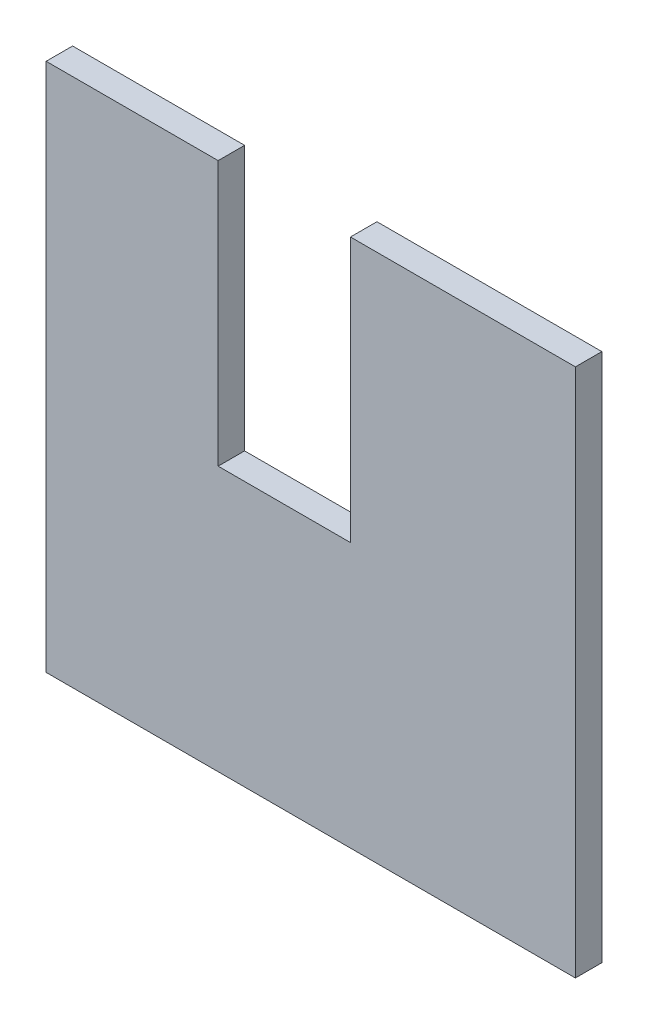
ISO-10303-21;
HEADER;
FILE_DESCRIPTION(('STEP AP214'),'2;1');
FILE_NAME('part.step','',(''),(''),'','','');
FILE_SCHEMA(('AUTOMOTIVE_DESIGN { 1 0 10303 214 1 1 1 1 }'));
ENDSEC;
DATA;
#1=APPLICATION_CONTEXT('core data for automotive mechanical design processes');
#2=APPLICATION_PROTOCOL_DEFINITION('international standard','automotive_design',2000,#1);
#3=PRODUCT_CONTEXT('',#1,'mechanical');
#4=PRODUCT('Part','Part','',(#3));
#5=PRODUCT_RELATED_PRODUCT_CATEGORY('part','',(#4));
#6=PRODUCT_DEFINITION_FORMATION('','',#4);
#7=PRODUCT_DEFINITION_CONTEXT('part definition',#1,'design');
#8=PRODUCT_DEFINITION('design','',#6,#7);
#9=PRODUCT_DEFINITION_SHAPE('','',#8);
#10=(LENGTH_UNIT() NAMED_UNIT(*) SI_UNIT(.MILLI.,.METRE.));
#11=(NAMED_UNIT(*) PLANE_ANGLE_UNIT() SI_UNIT($,.RADIAN.));
#12=(NAMED_UNIT(*) SI_UNIT($,.STERADIAN.) SOLID_ANGLE_UNIT());
#13=UNCERTAINTY_MEASURE_WITH_UNIT(LENGTH_MEASURE(1.E-05),#10,'distance_accuracy_value','');
#14=(GEOMETRIC_REPRESENTATION_CONTEXT(3) GLOBAL_UNCERTAINTY_ASSIGNED_CONTEXT((#13)) GLOBAL_UNIT_ASSIGNED_CONTEXT((#10,
#11,#12)) REPRESENTATION_CONTEXT('',''));
#15=CARTESIAN_POINT('',(0.,0.,0.));
#16=DIRECTION('',(0.,0.,1.));
#17=DIRECTION('',(1.,0.,0.));
#18=AXIS2_PLACEMENT_3D('',#15,#16,#17);
#19=CARTESIAN_POINT('',(25.,0.,10.));
#20=DIRECTION('',(-1.,0.,0.));
#21=DIRECTION('',(0.,-1.,0.));
#22=AXIS2_PLACEMENT_3D('',#19,#20,#21);
#23=PLANE('',#22);
#24=DIRECTION('',(0.,1.,0.));
#25=VECTOR('',#24,1.);
#26=CARTESIAN_POINT('',(25.,0.,0.));
#27=LINE('',#26,#25);
#28=CARTESIAN_POINT('',(25.,0.,0.));
#29=VERTEX_POINT('',#28);
#30=CARTESIAN_POINT('',(25.,100.,0.));
#31=VERTEX_POINT('',#30);
#32=EDGE_CURVE('E140',#29,#31,#27,.T.);
#33=ORIENTED_EDGE('',*,*,#32,.F.);
#34=DIRECTION('',(0.,0.,-1.));
#35=VECTOR('',#34,1.);
#36=CARTESIAN_POINT('',(25.,0.,10.));
#37=LINE('',#36,#35);
#38=CARTESIAN_POINT('',(25.,0.,10.));
#39=VERTEX_POINT('',#38);
#40=EDGE_CURVE('E11',#39,#29,#37,.T.);
#41=ORIENTED_EDGE('',*,*,#40,.F.);
#42=DIRECTION('',(0.,1.,0.));
#43=VECTOR('',#42,1.);
#44=CARTESIAN_POINT('',(25.,0.,10.));
#45=LINE('',#44,#43);
#46=CARTESIAN_POINT('',(25.,100.,10.));
#47=VERTEX_POINT('',#46);
#48=EDGE_CURVE('E195',#39,#47,#45,.T.);
#49=ORIENTED_EDGE('',*,*,#48,.T.);
#50=DIRECTION('',(0.,0.,-1.));
#51=VECTOR('',#50,1.);
#52=CARTESIAN_POINT('',(25.,100.,10.));
#53=LINE('',#52,#51);
#54=EDGE_CURVE('E58',#47,#31,#53,.T.);
#55=ORIENTED_EDGE('',*,*,#54,.T.);
#56=EDGE_LOOP('',(#33,#41,#49,#55));
#57=FACE_BOUND('',#56,.T.);
#58=ADVANCED_FACE('F41',(#57),#23,.T.);
#59=CARTESIAN_POINT('',(0.,0.,10.));
#60=DIRECTION('',(0.,1.,0.));
#61=DIRECTION('',(0.,0.,1.));
#62=AXIS2_PLACEMENT_3D('',#59,#60,#61);
#63=PLANE('',#62);
#64=DIRECTION('',(1.,0.,0.));
#65=VECTOR('',#64,1.);
#66=CARTESIAN_POINT('',(0.,0.,0.));
#67=LINE('',#66,#65);
#68=CARTESIAN_POINT('',(-25.,0.,0.));
#69=VERTEX_POINT('',#68);
#70=EDGE_CURVE('E143',#69,#29,#67,.T.);
#71=ORIENTED_EDGE('',*,*,#70,.F.);
#72=DIRECTION('',(0.,0.,-1.));
#73=VECTOR('',#72,1.);
#74=CARTESIAN_POINT('',(-25.,0.,10.));
#75=LINE('',#74,#73);
#76=CARTESIAN_POINT('',(-25.,0.,10.));
#77=VERTEX_POINT('',#76);
#78=EDGE_CURVE('E50',#77,#69,#75,.T.);
#79=ORIENTED_EDGE('',*,*,#78,.F.);
#80=DIRECTION('',(1.,0.,0.));
#81=VECTOR('',#80,1.);
#82=CARTESIAN_POINT('',(0.,0.,10.));
#83=LINE('',#82,#81);
#84=EDGE_CURVE('E191',#77,#39,#83,.T.);
#85=ORIENTED_EDGE('',*,*,#84,.T.);
#86=ORIENTED_EDGE('',*,*,#40,.T.);
#87=EDGE_LOOP('',(#71,#79,#85,#86));
#88=FACE_BOUND('',#87,.T.);
#89=ADVANCED_FACE('F190',(#88),#63,.T.);
#90=CARTESIAN_POINT('',(-25.,0.,10.));
#91=DIRECTION('',(-1.,0.,0.));
#92=DIRECTION('',(0.,-1.,0.));
#93=AXIS2_PLACEMENT_3D('',#90,#91,#92);
#94=PLANE('',#93);
#95=DIRECTION('',(0.,1.,0.));
#96=VECTOR('',#95,1.);
#97=CARTESIAN_POINT('',(-25.,0.,0.));
#98=LINE('',#97,#96);
#99=CARTESIAN_POINT('',(-25.,100.,0.));
#100=VERTEX_POINT('',#99);
#101=EDGE_CURVE('E147',#69,#100,#98,.T.);
#102=ORIENTED_EDGE('',*,*,#101,.T.);
#103=DIRECTION('',(0.,0.,-1.));
#104=VECTOR('',#103,1.);
#105=CARTESIAN_POINT('',(-25.,100.,10.));
#106=LINE('',#105,#104);
#107=CARTESIAN_POINT('',(-25.,100.,10.));
#108=VERTEX_POINT('',#107);
#109=EDGE_CURVE('E174',#108,#100,#106,.T.);
#110=ORIENTED_EDGE('',*,*,#109,.F.);
#111=DIRECTION('',(0.,1.,0.));
#112=VECTOR('',#111,1.);
#113=CARTESIAN_POINT('',(-25.,0.,10.));
#114=LINE('',#113,#112);
#115=EDGE_CURVE('E182',#77,#108,#114,.T.);
#116=ORIENTED_EDGE('',*,*,#115,.F.);
#117=ORIENTED_EDGE('',*,*,#78,.T.);
#118=EDGE_LOOP('',(#102,#110,#116,#117));
#119=FACE_BOUND('',#118,.T.);
#120=ADVANCED_FACE('F180',(#119),#94,.F.);
#121=CARTESIAN_POINT('',(0.,100.,10.));
#122=DIRECTION('',(0.,1.,0.));
#123=DIRECTION('',(-1.,0.,0.));
#124=AXIS2_PLACEMENT_3D('',#121,#122,#123);
#125=PLANE('',#124);
#126=DIRECTION('',(1.,0.,0.));
#127=VECTOR('',#126,1.);
#128=CARTESIAN_POINT('',(0.,100.,0.));
#129=LINE('',#128,#127);
#130=CARTESIAN_POINT('',(-90.,100.,0.));
#131=VERTEX_POINT('',#130);
#132=EDGE_CURVE('E151',#131,#100,#129,.T.);
#133=ORIENTED_EDGE('',*,*,#132,.F.);
#134=DIRECTION('',(0.,0.,-1.));
#135=VECTOR('',#134,1.);
#136=CARTESIAN_POINT('',(-90.,100.,10.));
#137=LINE('',#136,#135);
#138=CARTESIAN_POINT('',(-90.,100.,10.));
#139=VERTEX_POINT('',#138);
#140=EDGE_CURVE('E171',#139,#131,#137,.T.);
#141=ORIENTED_EDGE('',*,*,#140,.F.);
#142=DIRECTION('',(1.,0.,0.));
#143=VECTOR('',#142,1.);
#144=CARTESIAN_POINT('',(0.,100.,10.));
#145=LINE('',#144,#143);
#146=EDGE_CURVE('E137',#139,#108,#145,.T.);
#147=ORIENTED_EDGE('',*,*,#146,.T.);
#148=ORIENTED_EDGE('',*,*,#109,.T.);
#149=EDGE_LOOP('',(#133,#141,#147,#148));
#150=FACE_BOUND('',#149,.T.);
#151=ADVANCED_FACE('F209',(#150),#125,.T.);
#152=CARTESIAN_POINT('',(-90.,0.,10.));
#153=DIRECTION('',(-1.,0.,0.));
#154=DIRECTION('',(0.,-1.,0.));
#155=AXIS2_PLACEMENT_3D('',#152,#153,#154);
#156=PLANE('',#155);
#157=DIRECTION('',(0.,1.,0.));
#158=VECTOR('',#157,1.);
#159=CARTESIAN_POINT('',(-90.,0.,0.));
#160=LINE('',#159,#158);
#161=CARTESIAN_POINT('',(-90.,-100.,0.));
#162=VERTEX_POINT('',#161);
#163=EDGE_CURVE('E155',#162,#131,#160,.T.);
#164=ORIENTED_EDGE('',*,*,#163,.F.);
#165=DIRECTION('',(0.,0.,-1.));
#166=VECTOR('',#165,1.);
#167=CARTESIAN_POINT('',(-90.,-100.,10.));
#168=LINE('',#167,#166);
#169=CARTESIAN_POINT('',(-90.,-100.,10.));
#170=VERTEX_POINT('',#169);
#171=EDGE_CURVE('E129',#170,#162,#168,.T.);
#172=ORIENTED_EDGE('',*,*,#171,.F.);
#173=DIRECTION('',(0.,1.,0.));
#174=VECTOR('',#173,1.);
#175=CARTESIAN_POINT('',(-90.,0.,10.));
#176=LINE('',#175,#174);
#177=EDGE_CURVE('E117',#170,#139,#176,.T.);
#178=ORIENTED_EDGE('',*,*,#177,.T.);
#179=ORIENTED_EDGE('',*,*,#140,.T.);
#180=EDGE_LOOP('',(#164,#172,#178,#179));
#181=FACE_BOUND('',#180,.T.);
#182=ADVANCED_FACE('F207',(#181),#156,.T.);
#183=CARTESIAN_POINT('',(0.,-100.,10.));
#184=DIRECTION('',(0.,1.,0.));
#185=DIRECTION('',(-1.,0.,0.));
#186=AXIS2_PLACEMENT_3D('',#183,#184,#185);
#187=PLANE('',#186);
#188=DIRECTION('',(1.,0.,0.));
#189=VECTOR('',#188,1.);
#190=CARTESIAN_POINT('',(0.,-100.,0.));
#191=LINE('',#190,#189);
#192=CARTESIAN_POINT('',(110.,-100.,0.));
#193=VERTEX_POINT('',#192);
#194=EDGE_CURVE('E125',#162,#193,#191,.T.);
#195=ORIENTED_EDGE('',*,*,#194,.T.);
#196=DIRECTION('',(0.,0.,-1.));
#197=VECTOR('',#196,1.);
#198=CARTESIAN_POINT('',(110.,-100.,10.));
#199=LINE('',#198,#197);
#200=CARTESIAN_POINT('',(110.,-100.,10.));
#201=VERTEX_POINT('',#200);
#202=EDGE_CURVE('E122',#201,#193,#199,.T.);
#203=ORIENTED_EDGE('',*,*,#202,.F.);
#204=DIRECTION('',(1.,0.,0.));
#205=VECTOR('',#204,1.);
#206=CARTESIAN_POINT('',(0.,-100.,10.));
#207=LINE('',#206,#205);
#208=EDGE_CURVE('E109',#170,#201,#207,.T.);
#209=ORIENTED_EDGE('',*,*,#208,.F.);
#210=ORIENTED_EDGE('',*,*,#171,.T.);
#211=EDGE_LOOP('',(#195,#203,#209,#210));
#212=FACE_BOUND('',#211,.T.);
#213=ADVANCED_FACE('F123',(#212),#187,.F.);
#214=CARTESIAN_POINT('',(110.,0.,10.));
#215=DIRECTION('',(-1.,0.,0.));
#216=DIRECTION('',(0.,-1.,0.));
#217=AXIS2_PLACEMENT_3D('',#214,#215,#216);
#218=PLANE('',#217);
#219=DIRECTION('',(0.,1.,0.));
#220=VECTOR('',#219,1.);
#221=CARTESIAN_POINT('',(110.,0.,0.));
#222=LINE('',#221,#220);
#223=CARTESIAN_POINT('',(110.,100.,0.));
#224=VERTEX_POINT('',#223);
#225=EDGE_CURVE('E162',#193,#224,#222,.T.);
#226=ORIENTED_EDGE('',*,*,#225,.T.);
#227=DIRECTION('',(0.,0.,-1.));
#228=VECTOR('',#227,1.);
#229=CARTESIAN_POINT('',(110.,100.,10.));
#230=LINE('',#229,#228);
#231=CARTESIAN_POINT('',(110.,100.,10.));
#232=VERTEX_POINT('',#231);
#233=EDGE_CURVE('E84',#232,#224,#230,.T.);
#234=ORIENTED_EDGE('',*,*,#233,.F.);
#235=DIRECTION('',(0.,1.,0.));
#236=VECTOR('',#235,1.);
#237=CARTESIAN_POINT('',(110.,0.,10.));
#238=LINE('',#237,#236);
#239=EDGE_CURVE('E114',#201,#232,#238,.T.);
#240=ORIENTED_EDGE('',*,*,#239,.F.);
#241=ORIENTED_EDGE('',*,*,#202,.T.);
#242=EDGE_LOOP('',(#226,#234,#240,#241));
#243=FACE_BOUND('',#242,.T.);
#244=ADVANCED_FACE('F131',(#243),#218,.F.);
#245=EDGE_CURVE('E156',#31,#224,#129,.T.);
#246=ORIENTED_EDGE('',*,*,#245,.F.);
#247=ORIENTED_EDGE('',*,*,#54,.F.);
#248=EDGE_CURVE('E133',#47,#232,#145,.T.);
#249=ORIENTED_EDGE('',*,*,#248,.T.);
#250=ORIENTED_EDGE('',*,*,#233,.T.);
#251=EDGE_LOOP('',(#246,#247,#249,#250));
#252=FACE_BOUND('',#251,.T.);
#253=ADVANCED_FACE('F193',(#252),#125,.T.);
#254=CARTESIAN_POINT('',(0.,0.,10.));
#255=DIRECTION('',(0.,0.,1.));
#256=DIRECTION('',(1.,0.,0.));
#257=AXIS2_PLACEMENT_3D('',#254,#255,#256);
#258=PLANE('',#257);
#259=ORIENTED_EDGE('',*,*,#48,.F.);
#260=ORIENTED_EDGE('',*,*,#84,.F.);
#261=ORIENTED_EDGE('',*,*,#115,.T.);
#262=ORIENTED_EDGE('',*,*,#146,.F.);
#263=ORIENTED_EDGE('',*,*,#177,.F.);
#264=ORIENTED_EDGE('',*,*,#208,.T.);
#265=ORIENTED_EDGE('',*,*,#239,.T.);
#266=ORIENTED_EDGE('',*,*,#248,.F.);
#267=EDGE_LOOP('',(#259,#260,#261,#262,#263,#264,#265,#266));
#268=FACE_BOUND('',#267,.T.);
#269=ADVANCED_FACE('F111',(#268),#258,.T.);
#270=CARTESIAN_POINT('',(0.,0.,0.));
#271=DIRECTION('',(0.,0.,1.));
#272=DIRECTION('',(1.,0.,0.));
#273=AXIS2_PLACEMENT_3D('',#270,#271,#272);
#274=PLANE('',#273);
#275=ORIENTED_EDGE('',*,*,#32,.T.);
#276=ORIENTED_EDGE('',*,*,#245,.T.);
#277=ORIENTED_EDGE('',*,*,#225,.F.);
#278=ORIENTED_EDGE('',*,*,#194,.F.);
#279=ORIENTED_EDGE('',*,*,#163,.T.);
#280=ORIENTED_EDGE('',*,*,#132,.T.);
#281=ORIENTED_EDGE('',*,*,#101,.F.);
#282=ORIENTED_EDGE('',*,*,#70,.T.);
#283=EDGE_LOOP('',(#275,#276,#277,#278,#279,#280,#281,#282));
#284=FACE_BOUND('',#283,.T.);
#285=ADVANCED_FACE('F188',(#284),#274,.F.);
#286=CLOSED_SHELL('',(#58,#89,#120,#151,#182,#213,#244,#253,#269,#285));
#287=MANIFOLD_SOLID_BREP('B2',#286);
#288=ADVANCED_BREP_SHAPE_REPRESENTATION('',(#18,#287),#14);
#289=SHAPE_DEFINITION_REPRESENTATION(#9,#288);
ENDSEC;
END-ISO-10303-21;
